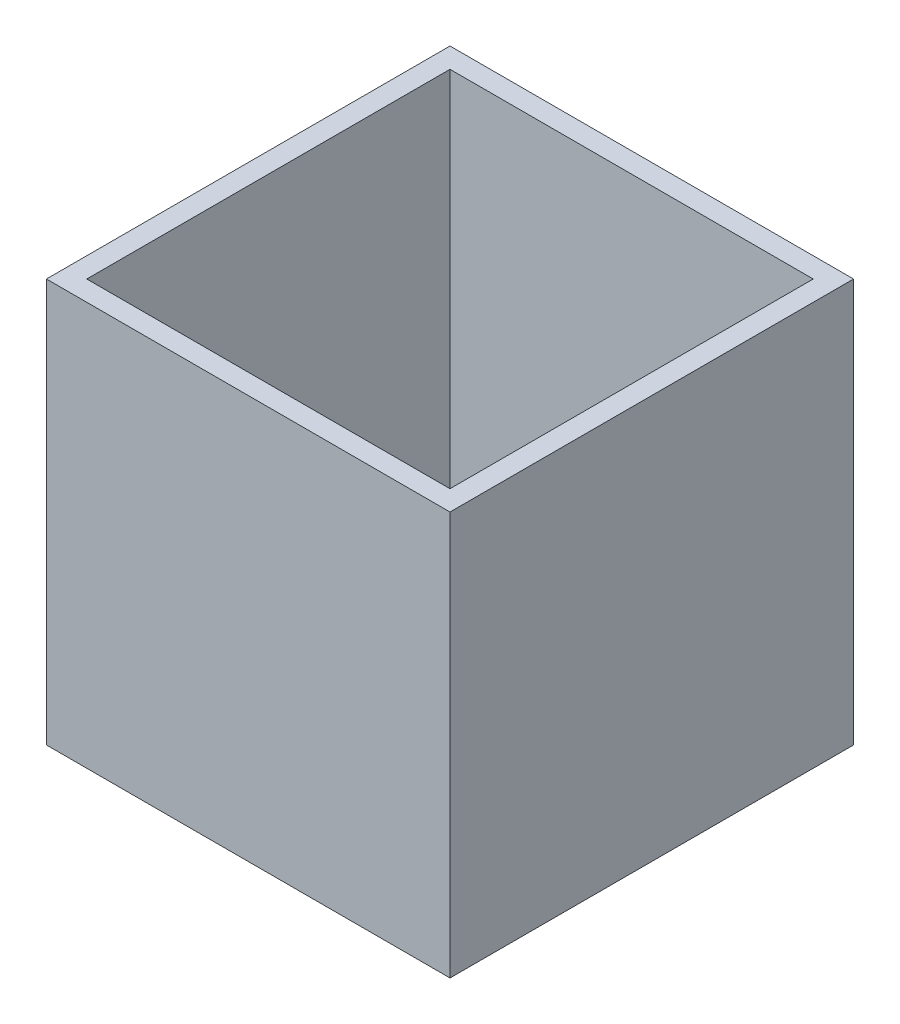
ISO-10303-21;
HEADER;
FILE_DESCRIPTION(('STEP AP214'),'2;1');
FILE_NAME('part.step','',(''),(''),'','','');
FILE_SCHEMA(('AUTOMOTIVE_DESIGN { 1 0 10303 214 1 1 1 1 }'));
ENDSEC;
DATA;
#1=APPLICATION_CONTEXT('core data for automotive mechanical design processes');
#2=APPLICATION_PROTOCOL_DEFINITION('international standard','automotive_design',2000,#1);
#3=PRODUCT_CONTEXT('',#1,'mechanical');
#4=PRODUCT('Part','Part','',(#3));
#5=PRODUCT_RELATED_PRODUCT_CATEGORY('part','',(#4));
#6=PRODUCT_DEFINITION_FORMATION('','',#4);
#7=PRODUCT_DEFINITION_CONTEXT('part definition',#1,'design');
#8=PRODUCT_DEFINITION('design','',#6,#7);
#9=PRODUCT_DEFINITION_SHAPE('','',#8);
#10=(LENGTH_UNIT() NAMED_UNIT(*) SI_UNIT(.MILLI.,.METRE.));
#11=(NAMED_UNIT(*) PLANE_ANGLE_UNIT() SI_UNIT($,.RADIAN.));
#12=(NAMED_UNIT(*) SI_UNIT($,.STERADIAN.) SOLID_ANGLE_UNIT());
#13=UNCERTAINTY_MEASURE_WITH_UNIT(LENGTH_MEASURE(1.E-05),#10,'distance_accuracy_value','');
#14=(GEOMETRIC_REPRESENTATION_CONTEXT(3) GLOBAL_UNCERTAINTY_ASSIGNED_CONTEXT((#13)) GLOBAL_UNIT_ASSIGNED_CONTEXT((#10,
#11,#12)) REPRESENTATION_CONTEXT('',''));
#15=CARTESIAN_POINT('',(0.,0.,0.));
#16=DIRECTION('',(0.,0.,1.));
#17=DIRECTION('',(1.,0.,0.));
#18=AXIS2_PLACEMENT_3D('',#15,#16,#17);
#19=CARTESIAN_POINT('',(-50.,100.,-50.));
#20=DIRECTION('',(1.,0.,0.));
#21=DIRECTION('',(0.,0.,-1.));
#22=AXIS2_PLACEMENT_3D('',#19,#20,#21);
#23=PLANE('',#22);
#24=DIRECTION('',(0.,0.,1.));
#25=VECTOR('',#24,1.);
#26=CARTESIAN_POINT('',(-50.,0.,-50.));
#27=LINE('',#26,#25);
#28=CARTESIAN_POINT('',(-50.,0.,-50.));
#29=VERTEX_POINT('',#28);
#30=CARTESIAN_POINT('',(-50.,0.,50.));
#31=VERTEX_POINT('',#30);
#32=EDGE_CURVE('E150',#29,#31,#27,.T.);
#33=ORIENTED_EDGE('',*,*,#32,.T.);
#34=DIRECTION('',(0.,-1.,0.));
#35=VECTOR('',#34,1.);
#36=CARTESIAN_POINT('',(-50.,100.,50.));
#37=LINE('',#36,#35);
#38=CARTESIAN_POINT('',(-50.,100.,50.));
#39=VERTEX_POINT('',#38);
#40=EDGE_CURVE('E11',#39,#31,#37,.T.);
#41=ORIENTED_EDGE('',*,*,#40,.F.);
#42=DIRECTION('',(0.,0.,1.));
#43=VECTOR('',#42,1.);
#44=CARTESIAN_POINT('',(-50.,100.,-50.));
#45=LINE('',#44,#43);
#46=CARTESIAN_POINT('',(-50.,100.,-50.));
#47=VERTEX_POINT('',#46);
#48=EDGE_CURVE('E143',#47,#39,#45,.T.);
#49=ORIENTED_EDGE('',*,*,#48,.F.);
#50=DIRECTION('',(0.,-1.,0.));
#51=VECTOR('',#50,1.);
#52=CARTESIAN_POINT('',(-50.,100.,-50.));
#53=LINE('',#52,#51);
#54=EDGE_CURVE('E149',#47,#29,#53,.T.);
#55=ORIENTED_EDGE('',*,*,#54,.T.);
#56=EDGE_LOOP('',(#33,#41,#49,#55));
#57=FACE_BOUND('',#56,.T.);
#58=ADVANCED_FACE('F36',(#57),#23,.F.);
#59=CARTESIAN_POINT('',(-50.,100.,50.));
#60=DIRECTION('',(0.,0.,-1.));
#61=DIRECTION('',(-1.,0.,0.));
#62=AXIS2_PLACEMENT_3D('',#59,#60,#61);
#63=PLANE('',#62);
#64=DIRECTION('',(1.,0.,0.));
#65=VECTOR('',#64,1.);
#66=CARTESIAN_POINT('',(-50.,0.,50.));
#67=LINE('',#66,#65);
#68=CARTESIAN_POINT('',(50.,0.,50.));
#69=VERTEX_POINT('',#68);
#70=EDGE_CURVE('E153',#31,#69,#67,.T.);
#71=ORIENTED_EDGE('',*,*,#70,.T.);
#72=DIRECTION('',(0.,-1.,0.));
#73=VECTOR('',#72,1.);
#74=CARTESIAN_POINT('',(50.,100.,50.));
#75=LINE('',#74,#73);
#76=CARTESIAN_POINT('',(50.,100.,50.));
#77=VERTEX_POINT('',#76);
#78=EDGE_CURVE('E43',#77,#69,#75,.T.);
#79=ORIENTED_EDGE('',*,*,#78,.F.);
#80=DIRECTION('',(1.,0.,0.));
#81=VECTOR('',#80,1.);
#82=CARTESIAN_POINT('',(-50.,100.,50.));
#83=LINE('',#82,#81);
#84=EDGE_CURVE('E87',#39,#77,#83,.T.);
#85=ORIENTED_EDGE('',*,*,#84,.F.);
#86=ORIENTED_EDGE('',*,*,#40,.T.);
#87=EDGE_LOOP('',(#71,#79,#85,#86));
#88=FACE_BOUND('',#87,.T.);
#89=ADVANCED_FACE('F182',(#88),#63,.F.);
#90=CARTESIAN_POINT('',(50.,100.,-50.));
#91=DIRECTION('',(-1.,0.,0.));
#92=DIRECTION('',(0.,0.,1.));
#93=AXIS2_PLACEMENT_3D('',#90,#91,#92);
#94=PLANE('',#93);
#95=DIRECTION('',(0.,0.,-1.));
#96=VECTOR('',#95,1.);
#97=CARTESIAN_POINT('',(50.,0.,-50.));
#98=LINE('',#97,#96);
#99=CARTESIAN_POINT('',(50.,0.,-50.));
#100=VERTEX_POINT('',#99);
#101=EDGE_CURVE('E155',#69,#100,#98,.T.);
#102=ORIENTED_EDGE('',*,*,#101,.T.);
#103=DIRECTION('',(0.,-1.,0.));
#104=VECTOR('',#103,1.);
#105=CARTESIAN_POINT('',(50.,100.,-50.));
#106=LINE('',#105,#104);
#107=CARTESIAN_POINT('',(50.,100.,-50.));
#108=VERTEX_POINT('',#107);
#109=EDGE_CURVE('E159',#108,#100,#106,.T.);
#110=ORIENTED_EDGE('',*,*,#109,.F.);
#111=DIRECTION('',(0.,0.,-1.));
#112=VECTOR('',#111,1.);
#113=CARTESIAN_POINT('',(50.,100.,-50.));
#114=LINE('',#113,#112);
#115=EDGE_CURVE('E146',#77,#108,#114,.T.);
#116=ORIENTED_EDGE('',*,*,#115,.F.);
#117=ORIENTED_EDGE('',*,*,#78,.T.);
#118=EDGE_LOOP('',(#102,#110,#116,#117));
#119=FACE_BOUND('',#118,.T.);
#120=ADVANCED_FACE('F164',(#119),#94,.F.);
#121=CARTESIAN_POINT('',(-50.,100.,-50.));
#122=DIRECTION('',(0.,0.,1.));
#123=DIRECTION('',(1.,0.,0.));
#124=AXIS2_PLACEMENT_3D('',#121,#122,#123);
#125=PLANE('',#124);
#126=DIRECTION('',(-1.,0.,0.));
#127=VECTOR('',#126,1.);
#128=CARTESIAN_POINT('',(-50.,0.,-50.));
#129=LINE('',#128,#127);
#130=EDGE_CURVE('E80',#100,#29,#129,.T.);
#131=ORIENTED_EDGE('',*,*,#130,.T.);
#132=ORIENTED_EDGE('',*,*,#54,.F.);
#133=DIRECTION('',(-1.,0.,0.));
#134=VECTOR('',#133,1.);
#135=CARTESIAN_POINT('',(-50.,100.,-50.));
#136=LINE('',#135,#134);
#137=EDGE_CURVE('E59',#108,#47,#136,.T.);
#138=ORIENTED_EDGE('',*,*,#137,.F.);
#139=ORIENTED_EDGE('',*,*,#109,.T.);
#140=EDGE_LOOP('',(#131,#132,#138,#139));
#141=FACE_BOUND('',#140,.T.);
#142=ADVANCED_FACE('F172',(#141),#125,.F.);
#143=CARTESIAN_POINT('',(0.,100.,0.));
#144=DIRECTION('',(0.,1.,0.));
#145=DIRECTION('',(0.,0.,1.));
#146=AXIS2_PLACEMENT_3D('',#143,#144,#145);
#147=PLANE('',#146);
#148=DIRECTION('',(0.,0.,1.));
#149=VECTOR('',#148,1.);
#150=CARTESIAN_POINT('',(-45.,100.,-50.));
#151=LINE('',#150,#149);
#152=CARTESIAN_POINT('',(-45.,100.,-45.));
#153=VERTEX_POINT('',#152);
#154=CARTESIAN_POINT('',(-45.,100.,45.));
#155=VERTEX_POINT('',#154);
#156=EDGE_CURVE('E132',#153,#155,#151,.T.);
#157=ORIENTED_EDGE('',*,*,#156,.F.);
#158=DIRECTION('',(-1.,0.,0.));
#159=VECTOR('',#158,1.);
#160=CARTESIAN_POINT('',(-50.,100.,-45.));
#161=LINE('',#160,#159);
#162=CARTESIAN_POINT('',(45.,100.,-45.));
#163=VERTEX_POINT('',#162);
#164=EDGE_CURVE('E141',#163,#153,#161,.T.);
#165=ORIENTED_EDGE('',*,*,#164,.F.);
#166=DIRECTION('',(0.,0.,-1.));
#167=VECTOR('',#166,1.);
#168=CARTESIAN_POINT('',(45.,100.,-50.));
#169=LINE('',#168,#167);
#170=CARTESIAN_POINT('',(45.,100.,45.));
#171=VERTEX_POINT('',#170);
#172=EDGE_CURVE('E139',#171,#163,#169,.T.);
#173=ORIENTED_EDGE('',*,*,#172,.F.);
#174=DIRECTION('',(1.,0.,0.));
#175=VECTOR('',#174,1.);
#176=CARTESIAN_POINT('',(-50.,100.,45.));
#177=LINE('',#176,#175);
#178=EDGE_CURVE('E124',#155,#171,#177,.T.);
#179=ORIENTED_EDGE('',*,*,#178,.F.);
#180=EDGE_LOOP('',(#157,#165,#173,#179));
#181=FACE_BOUND('',#180,.T.);
#182=ORIENTED_EDGE('',*,*,#48,.T.);
#183=ORIENTED_EDGE('',*,*,#84,.T.);
#184=ORIENTED_EDGE('',*,*,#115,.T.);
#185=ORIENTED_EDGE('',*,*,#137,.T.);
#186=EDGE_LOOP('',(#182,#183,#184,#185));
#187=FACE_BOUND('',#186,.T.);
#188=ADVANCED_FACE('F174',(#181,#187),#147,.T.);
#189=CARTESIAN_POINT('',(0.,0.,0.));
#190=DIRECTION('',(0.,1.,0.));
#191=DIRECTION('',(0.,0.,1.));
#192=AXIS2_PLACEMENT_3D('',#189,#190,#191);
#193=PLANE('',#192);
#194=ORIENTED_EDGE('',*,*,#32,.F.);
#195=ORIENTED_EDGE('',*,*,#130,.F.);
#196=ORIENTED_EDGE('',*,*,#101,.F.);
#197=ORIENTED_EDGE('',*,*,#70,.F.);
#198=EDGE_LOOP('',(#194,#195,#196,#197));
#199=FACE_BOUND('',#198,.T.);
#200=ADVANCED_FACE('F168',(#199),#193,.F.);
#201=CARTESIAN_POINT('',(-45.,100.,-50.));
#202=DIRECTION('',(1.,0.,0.));
#203=DIRECTION('',(0.,0.,-1.));
#204=AXIS2_PLACEMENT_3D('',#201,#202,#203);
#205=PLANE('',#204);
#206=DIRECTION('',(0.,0.,1.));
#207=VECTOR('',#206,1.);
#208=CARTESIAN_POINT('',(-45.,5.,-50.));
#209=LINE('',#208,#207);
#210=CARTESIAN_POINT('',(-45.,5.,-45.));
#211=VERTEX_POINT('',#210);
#212=CARTESIAN_POINT('',(-45.,5.,45.));
#213=VERTEX_POINT('',#212);
#214=EDGE_CURVE('E115',#211,#213,#209,.T.);
#215=ORIENTED_EDGE('',*,*,#214,.F.);
#216=DIRECTION('',(0.,-1.,0.));
#217=VECTOR('',#216,1.);
#218=CARTESIAN_POINT('',(-45.,100.,-45.));
#219=LINE('',#218,#217);
#220=EDGE_CURVE('E135',#153,#211,#219,.T.);
#221=ORIENTED_EDGE('',*,*,#220,.F.);
#222=ORIENTED_EDGE('',*,*,#156,.T.);
#223=DIRECTION('',(0.,-1.,0.));
#224=VECTOR('',#223,1.);
#225=CARTESIAN_POINT('',(-45.,100.,45.));
#226=LINE('',#225,#224);
#227=EDGE_CURVE('E127',#155,#213,#226,.T.);
#228=ORIENTED_EDGE('',*,*,#227,.T.);
#229=EDGE_LOOP('',(#215,#221,#222,#228));
#230=FACE_BOUND('',#229,.T.);
#231=ADVANCED_FACE('F209',(#230),#205,.T.);
#232=CARTESIAN_POINT('',(-50.,100.,45.));
#233=DIRECTION('',(0.,0.,-1.));
#234=DIRECTION('',(-1.,0.,0.));
#235=AXIS2_PLACEMENT_3D('',#232,#233,#234);
#236=PLANE('',#235);
#237=DIRECTION('',(1.,0.,0.));
#238=VECTOR('',#237,1.);
#239=CARTESIAN_POINT('',(-50.,5.,45.));
#240=LINE('',#239,#238);
#241=CARTESIAN_POINT('',(45.,5.,45.));
#242=VERTEX_POINT('',#241);
#243=EDGE_CURVE('E109',#213,#242,#240,.T.);
#244=ORIENTED_EDGE('',*,*,#243,.F.);
#245=ORIENTED_EDGE('',*,*,#227,.F.);
#246=ORIENTED_EDGE('',*,*,#178,.T.);
#247=DIRECTION('',(0.,-1.,0.));
#248=VECTOR('',#247,1.);
#249=CARTESIAN_POINT('',(45.,100.,45.));
#250=LINE('',#249,#248);
#251=EDGE_CURVE('E121',#171,#242,#250,.T.);
#252=ORIENTED_EDGE('',*,*,#251,.T.);
#253=EDGE_LOOP('',(#244,#245,#246,#252));
#254=FACE_BOUND('',#253,.T.);
#255=ADVANCED_FACE('F122',(#254),#236,.T.);
#256=CARTESIAN_POINT('',(45.,100.,-50.));
#257=DIRECTION('',(-1.,0.,0.));
#258=DIRECTION('',(0.,0.,1.));
#259=AXIS2_PLACEMENT_3D('',#256,#257,#258);
#260=PLANE('',#259);
#261=DIRECTION('',(0.,0.,-1.));
#262=VECTOR('',#261,1.);
#263=CARTESIAN_POINT('',(45.,5.,-50.));
#264=LINE('',#263,#262);
#265=CARTESIAN_POINT('',(45.,5.,-45.));
#266=VERTEX_POINT('',#265);
#267=EDGE_CURVE('E113',#242,#266,#264,.T.);
#268=ORIENTED_EDGE('',*,*,#267,.F.);
#269=ORIENTED_EDGE('',*,*,#251,.F.);
#270=ORIENTED_EDGE('',*,*,#172,.T.);
#271=DIRECTION('',(0.,-1.,0.));
#272=VECTOR('',#271,1.);
#273=CARTESIAN_POINT('',(45.,100.,-45.));
#274=LINE('',#273,#272);
#275=EDGE_CURVE('E50',#163,#266,#274,.T.);
#276=ORIENTED_EDGE('',*,*,#275,.T.);
#277=EDGE_LOOP('',(#268,#269,#270,#276));
#278=FACE_BOUND('',#277,.T.);
#279=ADVANCED_FACE('F129',(#278),#260,.T.);
#280=CARTESIAN_POINT('',(-50.,100.,-45.));
#281=DIRECTION('',(0.,0.,1.));
#282=DIRECTION('',(1.,0.,0.));
#283=AXIS2_PLACEMENT_3D('',#280,#281,#282);
#284=PLANE('',#283);
#285=DIRECTION('',(-1.,0.,0.));
#286=VECTOR('',#285,1.);
#287=CARTESIAN_POINT('',(-50.,5.,-45.));
#288=LINE('',#287,#286);
#289=EDGE_CURVE('E130',#266,#211,#288,.T.);
#290=ORIENTED_EDGE('',*,*,#289,.F.);
#291=ORIENTED_EDGE('',*,*,#275,.F.);
#292=ORIENTED_EDGE('',*,*,#164,.T.);
#293=ORIENTED_EDGE('',*,*,#220,.T.);
#294=EDGE_LOOP('',(#290,#291,#292,#293));
#295=FACE_BOUND('',#294,.T.);
#296=ADVANCED_FACE('F239',(#295),#284,.T.);
#297=CARTESIAN_POINT('',(0.,5.,0.));
#298=DIRECTION('',(0.,1.,0.));
#299=DIRECTION('',(0.,0.,1.));
#300=AXIS2_PLACEMENT_3D('',#297,#298,#299);
#301=PLANE('',#300);
#302=ORIENTED_EDGE('',*,*,#214,.T.);
#303=ORIENTED_EDGE('',*,*,#243,.T.);
#304=ORIENTED_EDGE('',*,*,#267,.T.);
#305=ORIENTED_EDGE('',*,*,#289,.T.);
#306=EDGE_LOOP('',(#302,#303,#304,#305));
#307=FACE_BOUND('',#306,.T.);
#308=ADVANCED_FACE('F111',(#307),#301,.T.);
#309=CLOSED_SHELL('',(#58,#89,#120,#142,#188,#200,#231,#255,#279,#296,#308));
#310=MANIFOLD_SOLID_BREP('B2',#309);
#311=ADVANCED_BREP_SHAPE_REPRESENTATION('',(#18,#310),#14);
#312=SHAPE_DEFINITION_REPRESENTATION(#9,#311);
ENDSEC;
END-ISO-10303-21;
